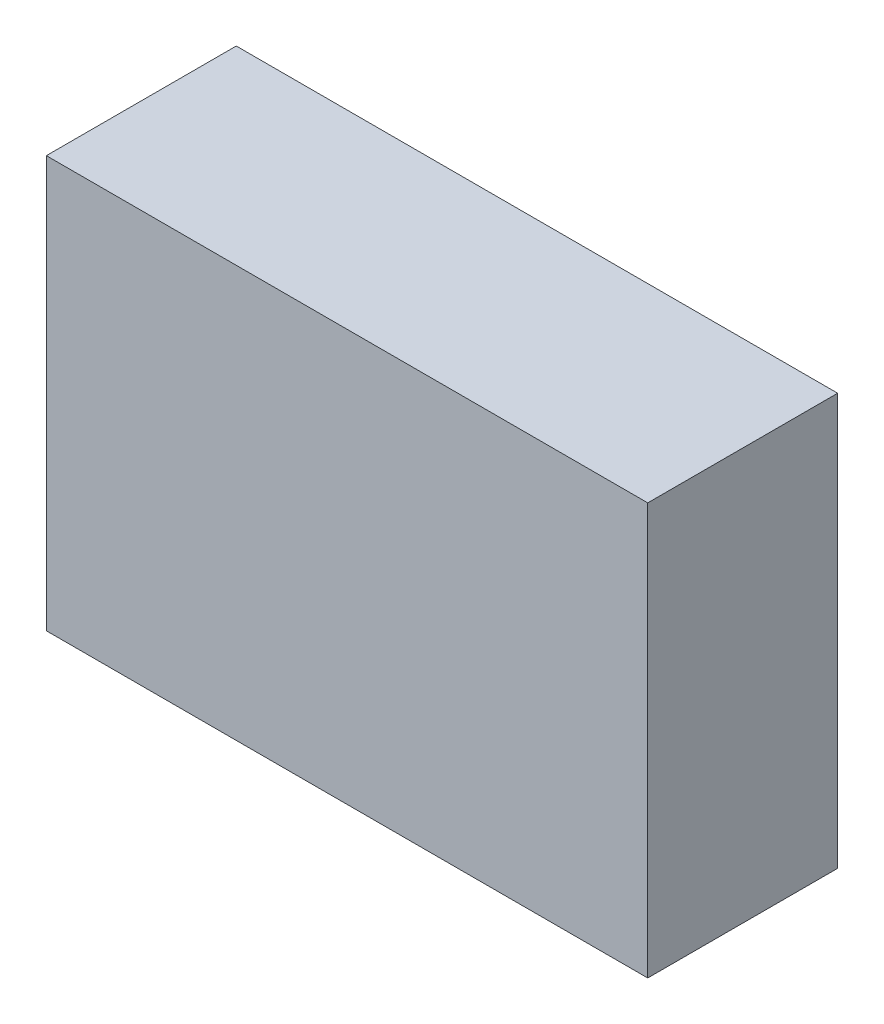
ISO-10303-21;
HEADER;
FILE_DESCRIPTION(('STEP AP214'),'2;1');
FILE_NAME('part.step','',(''),(''),'','','');
FILE_SCHEMA(('AUTOMOTIVE_DESIGN { 1 0 10303 214 1 1 1 1 }'));
ENDSEC;
DATA;
#1=APPLICATION_CONTEXT('core data for automotive mechanical design processes');
#2=APPLICATION_PROTOCOL_DEFINITION('international standard','automotive_design',2000,#1);
#3=PRODUCT_CONTEXT('',#1,'mechanical');
#4=PRODUCT('Part','Part','',(#3));
#5=PRODUCT_RELATED_PRODUCT_CATEGORY('part','',(#4));
#6=PRODUCT_DEFINITION_FORMATION('','',#4);
#7=PRODUCT_DEFINITION_CONTEXT('part definition',#1,'design');
#8=PRODUCT_DEFINITION('design','',#6,#7);
#9=PRODUCT_DEFINITION_SHAPE('','',#8);
#10=(LENGTH_UNIT() NAMED_UNIT(*) SI_UNIT(.MILLI.,.METRE.));
#11=(NAMED_UNIT(*) PLANE_ANGLE_UNIT() SI_UNIT($,.RADIAN.));
#12=(NAMED_UNIT(*) SI_UNIT($,.STERADIAN.) SOLID_ANGLE_UNIT());
#13=UNCERTAINTY_MEASURE_WITH_UNIT(LENGTH_MEASURE(1.E-05),#10,'distance_accuracy_value','');
#14=(GEOMETRIC_REPRESENTATION_CONTEXT(3) GLOBAL_UNCERTAINTY_ASSIGNED_CONTEXT((#13)) GLOBAL_UNIT_ASSIGNED_CONTEXT((#10,
#11,#12)) REPRESENTATION_CONTEXT('',''));
#15=CARTESIAN_POINT('',(0.,0.,0.));
#16=DIRECTION('',(0.,0.,1.));
#17=DIRECTION('',(1.,0.,0.));
#18=AXIS2_PLACEMENT_3D('',#15,#16,#17);
#19=CARTESIAN_POINT('',(0.,0.,300.));
#20=DIRECTION('',(1.,0.,0.));
#21=DIRECTION('',(0.,0.,-1.));
#22=AXIS2_PLACEMENT_3D('',#19,#20,#21);
#23=PLANE('',#22);
#24=DIRECTION('',(0.,-1.,0.));
#25=VECTOR('',#24,1.);
#26=CARTESIAN_POINT('',(0.,0.,0.));
#27=LINE('',#26,#25);
#28=CARTESIAN_POINT('',(0.,650.,0.));
#29=VERTEX_POINT('',#28);
#30=CARTESIAN_POINT('',(0.,0.,0.));
#31=VERTEX_POINT('',#30);
#32=EDGE_CURVE('E153',#29,#31,#27,.T.);
#33=ORIENTED_EDGE('',*,*,#32,.T.);
#34=DIRECTION('',(0.,0.,-1.));
#35=VECTOR('',#34,1.);
#36=CARTESIAN_POINT('',(0.,0.,300.));
#37=LINE('',#36,#35);
#38=CARTESIAN_POINT('',(0.,0.,300.));
#39=VERTEX_POINT('',#38);
#40=EDGE_CURVE('E142',#39,#31,#37,.T.);
#41=ORIENTED_EDGE('',*,*,#40,.F.);
#42=DIRECTION('',(0.,-1.,0.));
#43=VECTOR('',#42,1.);
#44=CARTESIAN_POINT('',(0.,0.,300.));
#45=LINE('',#44,#43);
#46=CARTESIAN_POINT('',(0.,650.,300.));
#47=VERTEX_POINT('',#46);
#48=EDGE_CURVE('E134',#47,#39,#45,.T.);
#49=ORIENTED_EDGE('',*,*,#48,.F.);
#50=DIRECTION('',(0.,0.,-1.));
#51=VECTOR('',#50,1.);
#52=CARTESIAN_POINT('',(0.,650.,300.));
#53=LINE('',#52,#51);
#54=EDGE_CURVE('E149',#47,#29,#53,.T.);
#55=ORIENTED_EDGE('',*,*,#54,.T.);
#56=EDGE_LOOP('',(#33,#41,#49,#55));
#57=FACE_BOUND('',#56,.T.);
#58=ADVANCED_FACE('F42',(#57),#23,.F.);
#59=CARTESIAN_POINT('',(0.,0.,300.));
#60=DIRECTION('',(0.,1.,0.));
#61=DIRECTION('',(0.,0.,1.));
#62=AXIS2_PLACEMENT_3D('',#59,#60,#61);
#63=PLANE('',#62);
#64=DIRECTION('',(1.,0.,0.));
#65=VECTOR('',#64,1.);
#66=CARTESIAN_POINT('',(0.,0.,0.));
#67=LINE('',#66,#65);
#68=CARTESIAN_POINT('',(950.,0.,0.));
#69=VERTEX_POINT('',#68);
#70=EDGE_CURVE('E140',#31,#69,#67,.T.);
#71=ORIENTED_EDGE('',*,*,#70,.T.);
#72=DIRECTION('',(0.,0.,-1.));
#73=VECTOR('',#72,1.);
#74=CARTESIAN_POINT('',(950.,0.,300.));
#75=LINE('',#74,#73);
#76=CARTESIAN_POINT('',(950.,0.,300.));
#77=VERTEX_POINT('',#76);
#78=EDGE_CURVE('E138',#77,#69,#75,.T.);
#79=ORIENTED_EDGE('',*,*,#78,.F.);
#80=DIRECTION('',(1.,0.,0.));
#81=VECTOR('',#80,1.);
#82=CARTESIAN_POINT('',(0.,0.,300.));
#83=LINE('',#82,#81);
#84=EDGE_CURVE('E129',#39,#77,#83,.T.);
#85=ORIENTED_EDGE('',*,*,#84,.F.);
#86=ORIENTED_EDGE('',*,*,#40,.T.);
#87=EDGE_LOOP('',(#71,#79,#85,#86));
#88=FACE_BOUND('',#87,.T.);
#89=ADVANCED_FACE('F139',(#88),#63,.F.);
#90=CARTESIAN_POINT('',(950.,0.,300.));
#91=DIRECTION('',(-1.,0.,0.));
#92=DIRECTION('',(0.,0.,1.));
#93=AXIS2_PLACEMENT_3D('',#90,#91,#92);
#94=PLANE('',#93);
#95=DIRECTION('',(0.,1.,0.));
#96=VECTOR('',#95,1.);
#97=CARTESIAN_POINT('',(950.,0.,0.));
#98=LINE('',#97,#96);
#99=CARTESIAN_POINT('',(950.,650.,0.));
#100=VERTEX_POINT('',#99);
#101=EDGE_CURVE('E115',#69,#100,#98,.T.);
#102=ORIENTED_EDGE('',*,*,#101,.T.);
#103=DIRECTION('',(0.,0.,-1.));
#104=VECTOR('',#103,1.);
#105=CARTESIAN_POINT('',(950.,650.,300.));
#106=LINE('',#105,#104);
#107=CARTESIAN_POINT('',(950.,650.,300.));
#108=VERTEX_POINT('',#107);
#109=EDGE_CURVE('E143',#108,#100,#106,.T.);
#110=ORIENTED_EDGE('',*,*,#109,.F.);
#111=DIRECTION('',(0.,1.,0.));
#112=VECTOR('',#111,1.);
#113=CARTESIAN_POINT('',(950.,0.,300.));
#114=LINE('',#113,#112);
#115=EDGE_CURVE('E132',#77,#108,#114,.T.);
#116=ORIENTED_EDGE('',*,*,#115,.F.);
#117=ORIENTED_EDGE('',*,*,#78,.T.);
#118=EDGE_LOOP('',(#102,#110,#116,#117));
#119=FACE_BOUND('',#118,.T.);
#120=ADVANCED_FACE('F145',(#119),#94,.F.);
#121=CARTESIAN_POINT('',(0.,650.,300.));
#122=DIRECTION('',(0.,-1.,0.));
#123=DIRECTION('',(0.,0.,-1.));
#124=AXIS2_PLACEMENT_3D('',#121,#122,#123);
#125=PLANE('',#124);
#126=DIRECTION('',(-1.,0.,0.));
#127=VECTOR('',#126,1.);
#128=CARTESIAN_POINT('',(0.,650.,0.));
#129=LINE('',#128,#127);
#130=EDGE_CURVE('E121',#100,#29,#129,.T.);
#131=ORIENTED_EDGE('',*,*,#130,.T.);
#132=ORIENTED_EDGE('',*,*,#54,.F.);
#133=DIRECTION('',(-1.,0.,0.));
#134=VECTOR('',#133,1.);
#135=CARTESIAN_POINT('',(0.,650.,300.));
#136=LINE('',#135,#134);
#137=EDGE_CURVE('E98',#108,#47,#136,.T.);
#138=ORIENTED_EDGE('',*,*,#137,.F.);
#139=ORIENTED_EDGE('',*,*,#109,.T.);
#140=EDGE_LOOP('',(#131,#132,#138,#139));
#141=FACE_BOUND('',#140,.T.);
#142=ADVANCED_FACE('F235',(#141),#125,.F.);
#143=CARTESIAN_POINT('',(0.,0.,300.));
#144=DIRECTION('',(0.,0.,-1.));
#145=DIRECTION('',(-1.,0.,0.));
#146=AXIS2_PLACEMENT_3D('',#143,#144,#145);
#147=PLANE('',#146);
#148=ORIENTED_EDGE('',*,*,#48,.T.);
#149=ORIENTED_EDGE('',*,*,#84,.T.);
#150=ORIENTED_EDGE('',*,*,#115,.T.);
#151=ORIENTED_EDGE('',*,*,#137,.T.);
#152=EDGE_LOOP('',(#148,#149,#150,#151));
#153=FACE_BOUND('',#152,.T.);
#154=ADVANCED_FACE('F130',(#153),#147,.F.);
#155=CARTESIAN_POINT('',(0.,0.,0.));
#156=DIRECTION('',(0.,0.,-1.));
#157=DIRECTION('',(-1.,0.,0.));
#158=AXIS2_PLACEMENT_3D('',#155,#156,#157);
#159=PLANE('',#158);
#160=ORIENTED_EDGE('',*,*,#32,.F.);
#161=ORIENTED_EDGE('',*,*,#130,.F.);
#162=ORIENTED_EDGE('',*,*,#101,.F.);
#163=ORIENTED_EDGE('',*,*,#70,.F.);
#164=EDGE_LOOP('',(#160,#161,#162,#163));
#165=FACE_BOUND('',#164,.T.);
#166=ADVANCED_FACE('F238',(#165),#159,.T.);
#167=CLOSED_SHELL('',(#58,#89,#120,#142,#154,#166));
#168=CARTESIAN_POINT('',(10.,0.,300.));
#169=DIRECTION('',(1.,0.,0.));
#170=DIRECTION('',(0.,0.,-1.));
#171=AXIS2_PLACEMENT_3D('',#168,#169,#170);
#172=PLANE('',#171);
#173=DIRECTION('',(0.,-1.,0.));
#174=VECTOR('',#173,1.);
#175=CARTESIAN_POINT('',(10.,0.,10.));
#176=LINE('',#175,#174);
#177=CARTESIAN_POINT('',(10.,640.,10.));
#178=VERTEX_POINT('',#177);
#179=CARTESIAN_POINT('',(10.,10.,10.));
#180=VERTEX_POINT('',#179);
#181=EDGE_CURVE('E46',#178,#180,#176,.T.);
#182=ORIENTED_EDGE('',*,*,#181,.F.);
#183=DIRECTION('',(0.,0.,-1.));
#184=VECTOR('',#183,1.);
#185=CARTESIAN_POINT('',(10.,640.,300.));
#186=LINE('',#185,#184);
#187=CARTESIAN_POINT('',(10.,640.,290.));
#188=VERTEX_POINT('',#187);
#189=EDGE_CURVE('E193',#188,#178,#186,.T.);
#190=ORIENTED_EDGE('',*,*,#189,.F.);
#191=DIRECTION('',(0.,-1.,0.));
#192=VECTOR('',#191,1.);
#193=CARTESIAN_POINT('',(10.,0.,290.));
#194=LINE('',#193,#192);
#195=CARTESIAN_POINT('',(10.,10.,290.));
#196=VERTEX_POINT('',#195);
#197=EDGE_CURVE('E173',#188,#196,#194,.T.);
#198=ORIENTED_EDGE('',*,*,#197,.T.);
#199=DIRECTION('',(0.,0.,-1.));
#200=VECTOR('',#199,1.);
#201=CARTESIAN_POINT('',(10.,10.,300.));
#202=LINE('',#201,#200);
#203=EDGE_CURVE('E189',#196,#180,#202,.T.);
#204=ORIENTED_EDGE('',*,*,#203,.T.);
#205=EDGE_LOOP('',(#182,#190,#198,#204));
#206=FACE_BOUND('',#205,.T.);
#207=ADVANCED_FACE('F202',(#206),#172,.T.);
#208=CARTESIAN_POINT('',(0.,10.,300.));
#209=DIRECTION('',(0.,1.,0.));
#210=DIRECTION('',(0.,0.,1.));
#211=AXIS2_PLACEMENT_3D('',#208,#209,#210);
#212=PLANE('',#211);
#213=DIRECTION('',(1.,0.,0.));
#214=VECTOR('',#213,1.);
#215=CARTESIAN_POINT('',(0.,10.,10.));
#216=LINE('',#215,#214);
#217=CARTESIAN_POINT('',(940.,10.,10.));
#218=VERTEX_POINT('',#217);
#219=EDGE_CURVE('E63',#180,#218,#216,.T.);
#220=ORIENTED_EDGE('',*,*,#219,.F.);
#221=ORIENTED_EDGE('',*,*,#203,.F.);
#222=DIRECTION('',(1.,0.,0.));
#223=VECTOR('',#222,1.);
#224=CARTESIAN_POINT('',(0.,10.,290.));
#225=LINE('',#224,#223);
#226=CARTESIAN_POINT('',(940.,10.,290.));
#227=VERTEX_POINT('',#226);
#228=EDGE_CURVE('E86',#196,#227,#225,.T.);
#229=ORIENTED_EDGE('',*,*,#228,.T.);
#230=DIRECTION('',(0.,0.,-1.));
#231=VECTOR('',#230,1.);
#232=CARTESIAN_POINT('',(940.,10.,300.));
#233=LINE('',#232,#231);
#234=EDGE_CURVE('E183',#227,#218,#233,.T.);
#235=ORIENTED_EDGE('',*,*,#234,.T.);
#236=EDGE_LOOP('',(#220,#221,#229,#235));
#237=FACE_BOUND('',#236,.T.);
#238=ADVANCED_FACE('F203',(#237),#212,.T.);
#239=CARTESIAN_POINT('',(940.,0.,300.));
#240=DIRECTION('',(-1.,0.,0.));
#241=DIRECTION('',(0.,0.,1.));
#242=AXIS2_PLACEMENT_3D('',#239,#240,#241);
#243=PLANE('',#242);
#244=DIRECTION('',(0.,1.,0.));
#245=VECTOR('',#244,1.);
#246=CARTESIAN_POINT('',(940.,0.,10.));
#247=LINE('',#246,#245);
#248=CARTESIAN_POINT('',(940.,640.,10.));
#249=VERTEX_POINT('',#248);
#250=EDGE_CURVE('E186',#218,#249,#247,.T.);
#251=ORIENTED_EDGE('',*,*,#250,.F.);
#252=ORIENTED_EDGE('',*,*,#234,.F.);
#253=DIRECTION('',(0.,1.,0.));
#254=VECTOR('',#253,1.);
#255=CARTESIAN_POINT('',(940.,0.,290.));
#256=LINE('',#255,#254);
#257=CARTESIAN_POINT('',(940.,640.,290.));
#258=VERTEX_POINT('',#257);
#259=EDGE_CURVE('E54',#227,#258,#256,.T.);
#260=ORIENTED_EDGE('',*,*,#259,.T.);
#261=DIRECTION('',(0.,0.,-1.));
#262=VECTOR('',#261,1.);
#263=CARTESIAN_POINT('',(940.,640.,300.));
#264=LINE('',#263,#262);
#265=EDGE_CURVE('E176',#258,#249,#264,.T.);
#266=ORIENTED_EDGE('',*,*,#265,.T.);
#267=EDGE_LOOP('',(#251,#252,#260,#266));
#268=FACE_BOUND('',#267,.T.);
#269=ADVANCED_FACE('F207',(#268),#243,.T.);
#270=CARTESIAN_POINT('',(0.,640.,300.));
#271=DIRECTION('',(0.,-1.,0.));
#272=DIRECTION('',(0.,0.,-1.));
#273=AXIS2_PLACEMENT_3D('',#270,#271,#272);
#274=PLANE('',#273);
#275=DIRECTION('',(-1.,0.,0.));
#276=VECTOR('',#275,1.);
#277=CARTESIAN_POINT('',(0.,640.,10.));
#278=LINE('',#277,#276);
#279=EDGE_CURVE('E180',#249,#178,#278,.T.);
#280=ORIENTED_EDGE('',*,*,#279,.F.);
#281=ORIENTED_EDGE('',*,*,#265,.F.);
#282=DIRECTION('',(-1.,0.,0.));
#283=VECTOR('',#282,1.);
#284=CARTESIAN_POINT('',(0.,640.,290.));
#285=LINE('',#284,#283);
#286=EDGE_CURVE('E11',#258,#188,#285,.T.);
#287=ORIENTED_EDGE('',*,*,#286,.T.);
#288=ORIENTED_EDGE('',*,*,#189,.T.);
#289=EDGE_LOOP('',(#280,#281,#287,#288));
#290=FACE_BOUND('',#289,.T.);
#291=ADVANCED_FACE('F211',(#290),#274,.T.);
#292=CARTESIAN_POINT('',(0.,0.,290.));
#293=DIRECTION('',(0.,0.,-1.));
#294=DIRECTION('',(-1.,0.,0.));
#295=AXIS2_PLACEMENT_3D('',#292,#293,#294);
#296=PLANE('',#295);
#297=ORIENTED_EDGE('',*,*,#197,.F.);
#298=ORIENTED_EDGE('',*,*,#286,.F.);
#299=ORIENTED_EDGE('',*,*,#259,.F.);
#300=ORIENTED_EDGE('',*,*,#228,.F.);
#301=EDGE_LOOP('',(#297,#298,#299,#300));
#302=FACE_BOUND('',#301,.T.);
#303=ADVANCED_FACE('F210',(#302),#296,.T.);
#304=CARTESIAN_POINT('',(0.,0.,10.));
#305=DIRECTION('',(0.,0.,-1.));
#306=DIRECTION('',(-1.,0.,0.));
#307=AXIS2_PLACEMENT_3D('',#304,#305,#306);
#308=PLANE('',#307);
#309=ORIENTED_EDGE('',*,*,#181,.T.);
#310=ORIENTED_EDGE('',*,*,#219,.T.);
#311=ORIENTED_EDGE('',*,*,#250,.T.);
#312=ORIENTED_EDGE('',*,*,#279,.T.);
#313=EDGE_LOOP('',(#309,#310,#311,#312));
#314=FACE_BOUND('',#313,.T.);
#315=ADVANCED_FACE('F44',(#314),#308,.F.);
#316=CLOSED_SHELL('',(#207,#238,#269,#291,#303,#315));
#317=ORIENTED_CLOSED_SHELL('',*,#316,.T.);
#318=BREP_WITH_VOIDS('B2',#167,(#317));
#319=ADVANCED_BREP_SHAPE_REPRESENTATION('',(#18,#318),#14);
#320=SHAPE_DEFINITION_REPRESENTATION(#9,#319);
ENDSEC;
END-ISO-10303-21;
